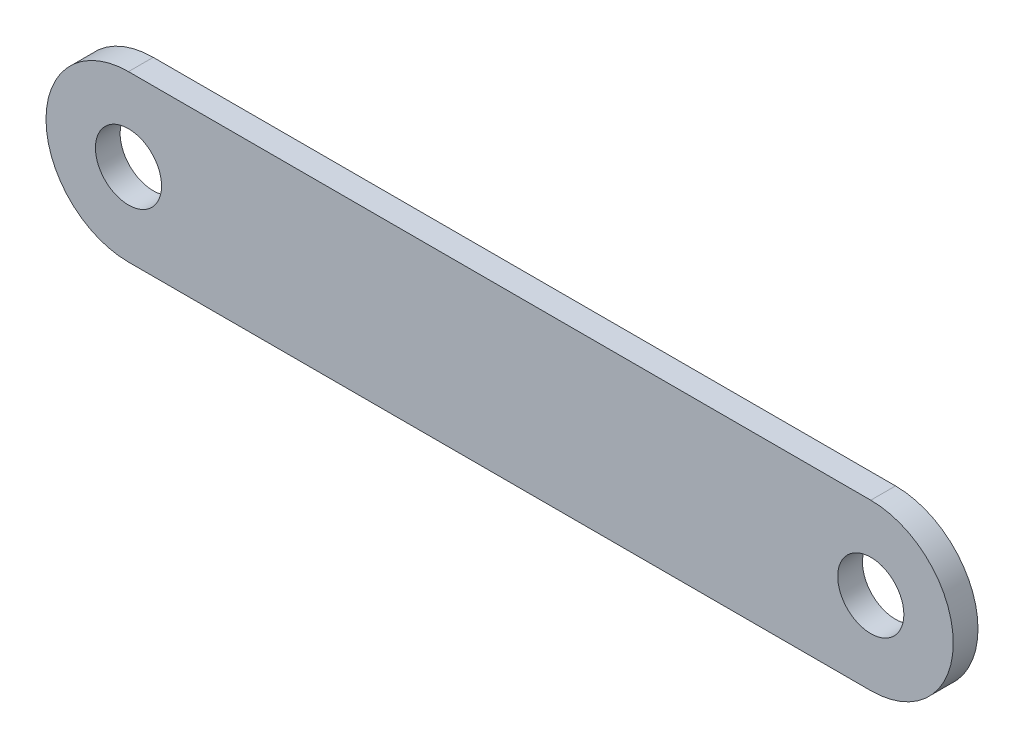
ISO-10303-21;
HEADER;
FILE_DESCRIPTION(('STEP AP214'),'2;1');
FILE_NAME('part.step','',(''),(''),'','','');
FILE_SCHEMA(('AUTOMOTIVE_DESIGN { 1 0 10303 214 1 1 1 1 }'));
ENDSEC;
DATA;
#1=APPLICATION_CONTEXT('core data for automotive mechanical design processes');
#2=APPLICATION_PROTOCOL_DEFINITION('international standard','automotive_design',2000,#1);
#3=PRODUCT_CONTEXT('',#1,'mechanical');
#4=PRODUCT('Part','Part','',(#3));
#5=PRODUCT_RELATED_PRODUCT_CATEGORY('part','',(#4));
#6=PRODUCT_DEFINITION_FORMATION('','',#4);
#7=PRODUCT_DEFINITION_CONTEXT('part definition',#1,'design');
#8=PRODUCT_DEFINITION('design','',#6,#7);
#9=PRODUCT_DEFINITION_SHAPE('','',#8);
#10=(LENGTH_UNIT() NAMED_UNIT(*) SI_UNIT(.MILLI.,.METRE.));
#11=(NAMED_UNIT(*) PLANE_ANGLE_UNIT() SI_UNIT($,.RADIAN.));
#12=(NAMED_UNIT(*) SI_UNIT($,.STERADIAN.) SOLID_ANGLE_UNIT());
#13=UNCERTAINTY_MEASURE_WITH_UNIT(LENGTH_MEASURE(1.E-05),#10,'distance_accuracy_value','');
#14=(GEOMETRIC_REPRESENTATION_CONTEXT(3) GLOBAL_UNCERTAINTY_ASSIGNED_CONTEXT((#13)) GLOBAL_UNIT_ASSIGNED_CONTEXT((#10,
#11,#12)) REPRESENTATION_CONTEXT('',''));
#15=CARTESIAN_POINT('',(0.,0.,0.));
#16=DIRECTION('',(0.,0.,1.));
#17=DIRECTION('',(1.,0.,0.));
#18=AXIS2_PLACEMENT_3D('',#15,#16,#17);
#19=CARTESIAN_POINT('',(0.,0.,3.));
#20=DIRECTION('',(0.,0.,-1.));
#21=DIRECTION('',(-1.,0.,0.));
#22=AXIS2_PLACEMENT_3D('',#19,#20,#21);
#23=CYLINDRICAL_SURFACE('',#22,10.);
#24=CARTESIAN_POINT('',(0.,0.,0.));
#25=DIRECTION('',(0.,0.,1.));
#26=DIRECTION('',(1.,0.,0.));
#27=AXIS2_PLACEMENT_3D('',#24,#25,#26);
#28=CIRCLE('',#27,10.);
#29=CARTESIAN_POINT('',(0.,10.,0.));
#30=VERTEX_POINT('',#29);
#31=CARTESIAN_POINT('',(0.,-10.,0.));
#32=VERTEX_POINT('',#31);
#33=EDGE_CURVE('E103',#30,#32,#28,.T.);
#34=ORIENTED_EDGE('',*,*,#33,.T.);
#35=DIRECTION('',(0.,0.,-1.));
#36=VECTOR('',#35,1.);
#37=CARTESIAN_POINT('',(0.,-10.,3.));
#38=LINE('',#37,#36);
#39=CARTESIAN_POINT('',(0.,-10.,3.));
#40=VERTEX_POINT('',#39);
#41=EDGE_CURVE('E11',#40,#32,#38,.T.);
#42=ORIENTED_EDGE('',*,*,#41,.F.);
#43=CARTESIAN_POINT('',(0.,0.,3.));
#44=DIRECTION('',(0.,0.,1.));
#45=DIRECTION('',(1.,0.,0.));
#46=AXIS2_PLACEMENT_3D('',#43,#44,#45);
#47=CIRCLE('',#46,10.);
#48=CARTESIAN_POINT('',(0.,10.,3.));
#49=VERTEX_POINT('',#48);
#50=EDGE_CURVE('E88',#49,#40,#47,.T.);
#51=ORIENTED_EDGE('',*,*,#50,.F.);
#52=DIRECTION('',(0.,0.,-1.));
#53=VECTOR('',#52,1.);
#54=CARTESIAN_POINT('',(0.,10.,3.));
#55=LINE('',#54,#53);
#56=EDGE_CURVE('E55',#49,#30,#55,.T.);
#57=ORIENTED_EDGE('',*,*,#56,.T.);
#58=EDGE_LOOP('',(#34,#42,#51,#57));
#59=FACE_BOUND('',#58,.T.);
#60=ADVANCED_FACE('F37',(#59),#23,.T.);
#61=CARTESIAN_POINT('',(0.,-10.,3.));
#62=DIRECTION('',(0.,1.,0.));
#63=DIRECTION('',(0.,0.,1.));
#64=AXIS2_PLACEMENT_3D('',#61,#62,#63);
#65=PLANE('',#64);
#66=DIRECTION('',(1.,0.,0.));
#67=VECTOR('',#66,1.);
#68=CARTESIAN_POINT('',(0.,-10.,0.));
#69=LINE('',#68,#67);
#70=CARTESIAN_POINT('',(90.,-10.,0.));
#71=VERTEX_POINT('',#70);
#72=EDGE_CURVE('E93',#32,#71,#69,.T.);
#73=ORIENTED_EDGE('',*,*,#72,.T.);
#74=DIRECTION('',(0.,0.,-1.));
#75=VECTOR('',#74,1.);
#76=CARTESIAN_POINT('',(90.,-10.,3.));
#77=LINE('',#76,#75);
#78=CARTESIAN_POINT('',(90.,-10.,3.));
#79=VERTEX_POINT('',#78);
#80=EDGE_CURVE('E46',#79,#71,#77,.T.);
#81=ORIENTED_EDGE('',*,*,#80,.F.);
#82=DIRECTION('',(1.,0.,0.));
#83=VECTOR('',#82,1.);
#84=CARTESIAN_POINT('',(0.,-10.,3.));
#85=LINE('',#84,#83);
#86=EDGE_CURVE('E81',#40,#79,#85,.T.);
#87=ORIENTED_EDGE('',*,*,#86,.F.);
#88=ORIENTED_EDGE('',*,*,#41,.T.);
#89=EDGE_LOOP('',(#73,#81,#87,#88));
#90=FACE_BOUND('',#89,.T.);
#91=ADVANCED_FACE('F92',(#90),#65,.F.);
#92=CARTESIAN_POINT('',(90.,0.,3.));
#93=DIRECTION('',(0.,0.,-1.));
#94=DIRECTION('',(-1.,0.,0.));
#95=AXIS2_PLACEMENT_3D('',#92,#93,#94);
#96=CYLINDRICAL_SURFACE('',#95,9.99999999999999);
#97=CARTESIAN_POINT('',(90.,0.,0.));
#98=DIRECTION('',(0.,0.,1.));
#99=DIRECTION('',(1.,0.,0.));
#100=AXIS2_PLACEMENT_3D('',#97,#98,#99);
#101=CIRCLE('',#100,9.99999999999999);
#102=CARTESIAN_POINT('',(90.,10.,0.));
#103=VERTEX_POINT('',#102);
#104=EDGE_CURVE('E106',#71,#103,#101,.T.);
#105=ORIENTED_EDGE('',*,*,#104,.T.);
#106=DIRECTION('',(0.,0.,-1.));
#107=VECTOR('',#106,1.);
#108=CARTESIAN_POINT('',(90.,10.,3.));
#109=LINE('',#108,#107);
#110=CARTESIAN_POINT('',(90.,10.,3.));
#111=VERTEX_POINT('',#110);
#112=EDGE_CURVE('E70',#111,#103,#109,.T.);
#113=ORIENTED_EDGE('',*,*,#112,.F.);
#114=CARTESIAN_POINT('',(90.,0.,3.));
#115=DIRECTION('',(0.,0.,1.));
#116=DIRECTION('',(1.,0.,0.));
#117=AXIS2_PLACEMENT_3D('',#114,#115,#116);
#118=CIRCLE('',#117,9.99999999999999);
#119=EDGE_CURVE('E87',#79,#111,#118,.T.);
#120=ORIENTED_EDGE('',*,*,#119,.F.);
#121=ORIENTED_EDGE('',*,*,#80,.T.);
#122=EDGE_LOOP('',(#105,#113,#120,#121));
#123=FACE_BOUND('',#122,.T.);
#124=ADVANCED_FACE('F97',(#123),#96,.T.);
#125=CARTESIAN_POINT('',(0.,10.,3.));
#126=DIRECTION('',(0.,1.,0.));
#127=DIRECTION('',(-1.,0.,0.));
#128=AXIS2_PLACEMENT_3D('',#125,#126,#127);
#129=PLANE('',#128);
#130=DIRECTION('',(1.,0.,0.));
#131=VECTOR('',#130,1.);
#132=CARTESIAN_POINT('',(0.,10.,0.));
#133=LINE('',#132,#131);
#134=EDGE_CURVE('E108',#30,#103,#133,.T.);
#135=ORIENTED_EDGE('',*,*,#134,.F.);
#136=ORIENTED_EDGE('',*,*,#56,.F.);
#137=DIRECTION('',(1.,0.,0.));
#138=VECTOR('',#137,1.);
#139=CARTESIAN_POINT('',(0.,10.,3.));
#140=LINE('',#139,#138);
#141=EDGE_CURVE('E98',#49,#111,#140,.T.);
#142=ORIENTED_EDGE('',*,*,#141,.T.);
#143=ORIENTED_EDGE('',*,*,#112,.T.);
#144=EDGE_LOOP('',(#135,#136,#142,#143));
#145=FACE_BOUND('',#144,.T.);
#146=ADVANCED_FACE('F132',(#145),#129,.T.);
#147=CARTESIAN_POINT('',(0.,0.,3.));
#148=DIRECTION('',(0.,0.,1.));
#149=DIRECTION('',(1.,0.,0.));
#150=AXIS2_PLACEMENT_3D('',#147,#148,#149);
#151=PLANE('',#150);
#152=CARTESIAN_POINT('',(0.,0.,3.));
#153=DIRECTION('',(0.,0.,1.));
#154=DIRECTION('',(1.,0.,0.));
#155=AXIS2_PLACEMENT_3D('',#152,#153,#154);
#156=CIRCLE('',#155,4.01);
#157=CARTESIAN_POINT('',(4.01,0.,3.));
#158=VERTEX_POINT('',#157);
#159=EDGE_CURVE('E114',#158,#158,#156,.T.);
#160=ORIENTED_EDGE('',*,*,#159,.F.);
#161=EDGE_LOOP('',(#160));
#162=FACE_BOUND('',#161,.T.);
#163=CARTESIAN_POINT('',(90.,0.,3.));
#164=DIRECTION('',(0.,0.,1.));
#165=DIRECTION('',(1.,0.,0.));
#166=AXIS2_PLACEMENT_3D('',#163,#164,#165);
#167=CIRCLE('',#166,4.01);
#168=CARTESIAN_POINT('',(94.01,0.,3.));
#169=VERTEX_POINT('',#168);
#170=EDGE_CURVE('E119',#169,#169,#167,.T.);
#171=ORIENTED_EDGE('',*,*,#170,.F.);
#172=EDGE_LOOP('',(#171));
#173=FACE_BOUND('',#172,.T.);
#174=ORIENTED_EDGE('',*,*,#50,.T.);
#175=ORIENTED_EDGE('',*,*,#86,.T.);
#176=ORIENTED_EDGE('',*,*,#119,.T.);
#177=ORIENTED_EDGE('',*,*,#141,.F.);
#178=EDGE_LOOP('',(#174,#175,#176,#177));
#179=FACE_BOUND('',#178,.T.);
#180=ADVANCED_FACE('F84',(#162,#173,#179),#151,.T.);
#181=CARTESIAN_POINT('',(0.,0.,0.));
#182=DIRECTION('',(0.,0.,1.));
#183=DIRECTION('',(1.,0.,0.));
#184=AXIS2_PLACEMENT_3D('',#181,#182,#183);
#185=PLANE('',#184);
#186=CARTESIAN_POINT('',(0.,0.,0.));
#187=DIRECTION('',(0.,0.,1.));
#188=DIRECTION('',(1.,0.,0.));
#189=AXIS2_PLACEMENT_3D('',#186,#187,#188);
#190=CIRCLE('',#189,4.01);
#191=CARTESIAN_POINT('',(4.01,0.,0.));
#192=VERTEX_POINT('',#191);
#193=EDGE_CURVE('E40',#192,#192,#190,.T.);
#194=ORIENTED_EDGE('',*,*,#193,.T.);
#195=EDGE_LOOP('',(#194));
#196=FACE_BOUND('',#195,.T.);
#197=CARTESIAN_POINT('',(90.,0.,0.));
#198=DIRECTION('',(0.,0.,1.));
#199=DIRECTION('',(1.,0.,0.));
#200=AXIS2_PLACEMENT_3D('',#197,#198,#199);
#201=CIRCLE('',#200,4.01);
#202=CARTESIAN_POINT('',(94.01,0.,0.));
#203=VERTEX_POINT('',#202);
#204=EDGE_CURVE('E112',#203,#203,#201,.T.);
#205=ORIENTED_EDGE('',*,*,#204,.T.);
#206=EDGE_LOOP('',(#205));
#207=FACE_BOUND('',#206,.T.);
#208=ORIENTED_EDGE('',*,*,#33,.F.);
#209=ORIENTED_EDGE('',*,*,#134,.T.);
#210=ORIENTED_EDGE('',*,*,#104,.F.);
#211=ORIENTED_EDGE('',*,*,#72,.F.);
#212=EDGE_LOOP('',(#208,#209,#210,#211));
#213=FACE_BOUND('',#212,.T.);
#214=ADVANCED_FACE('F131',(#196,#207,#213),#185,.F.);
#215=CARTESIAN_POINT('',(90.,0.,-7.));
#216=DIRECTION('',(0.,0.,1.));
#217=DIRECTION('',(1.,0.,0.));
#218=AXIS2_PLACEMENT_3D('',#215,#216,#217);
#219=CYLINDRICAL_SURFACE('',#218,4.01);
#220=ORIENTED_EDGE('',*,*,#170,.T.);
#221=EDGE_LOOP('',(#220));
#222=FACE_BOUND('',#221,.T.);
#223=ORIENTED_EDGE('',*,*,#204,.F.);
#224=EDGE_LOOP('',(#223));
#225=FACE_BOUND('',#224,.T.);
#226=ADVANCED_FACE('F127',(#222,#225),#219,.F.);
#227=CARTESIAN_POINT('',(0.,0.,-7.));
#228=DIRECTION('',(0.,0.,1.));
#229=DIRECTION('',(1.,0.,0.));
#230=AXIS2_PLACEMENT_3D('',#227,#228,#229);
#231=CYLINDRICAL_SURFACE('',#230,4.01);
#232=ORIENTED_EDGE('',*,*,#159,.T.);
#233=EDGE_LOOP('',(#232));
#234=FACE_BOUND('',#233,.T.);
#235=ORIENTED_EDGE('',*,*,#193,.F.);
#236=EDGE_LOOP('',(#235));
#237=FACE_BOUND('',#236,.T.);
#238=ADVANCED_FACE('F181',(#234,#237),#231,.F.);
#239=CLOSED_SHELL('',(#60,#91,#124,#146,#180,#214,#226,#238));
#240=MANIFOLD_SOLID_BREP('B2',#239);
#241=ADVANCED_BREP_SHAPE_REPRESENTATION('',(#18,#240),#14);
#242=SHAPE_DEFINITION_REPRESENTATION(#9,#241);
ENDSEC;
END-ISO-10303-21;
